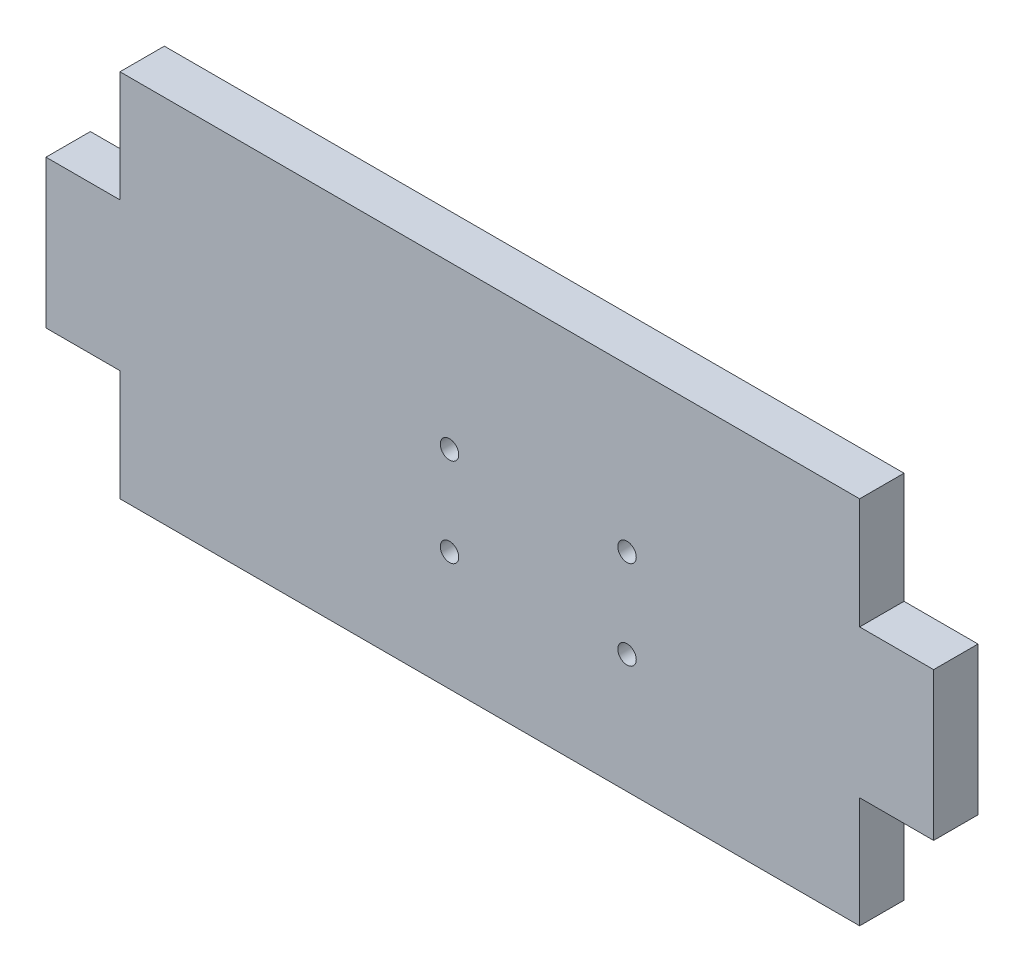
ISO-10303-21;
HEADER;
FILE_DESCRIPTION(('STEP AP214'),'2;1');
FILE_NAME('part.step','',(''),(''),'','','');
FILE_SCHEMA(('AUTOMOTIVE_DESIGN { 1 0 10303 214 1 1 1 1 }'));
ENDSEC;
DATA;
#1=APPLICATION_CONTEXT('core data for automotive mechanical design processes');
#2=APPLICATION_PROTOCOL_DEFINITION('international standard','automotive_design',2000,#1);
#3=PRODUCT_CONTEXT('',#1,'mechanical');
#4=PRODUCT('Part','Part','',(#3));
#5=PRODUCT_RELATED_PRODUCT_CATEGORY('part','',(#4));
#6=PRODUCT_DEFINITION_FORMATION('','',#4);
#7=PRODUCT_DEFINITION_CONTEXT('part definition',#1,'design');
#8=PRODUCT_DEFINITION('design','',#6,#7);
#9=PRODUCT_DEFINITION_SHAPE('','',#8);
#10=(LENGTH_UNIT() NAMED_UNIT(*) SI_UNIT(.MILLI.,.METRE.));
#11=(NAMED_UNIT(*) PLANE_ANGLE_UNIT() SI_UNIT($,.RADIAN.));
#12=(NAMED_UNIT(*) SI_UNIT($,.STERADIAN.) SOLID_ANGLE_UNIT());
#13=UNCERTAINTY_MEASURE_WITH_UNIT(LENGTH_MEASURE(1.E-05),#10,'distance_accuracy_value','');
#14=(GEOMETRIC_REPRESENTATION_CONTEXT(3) GLOBAL_UNCERTAINTY_ASSIGNED_CONTEXT((#13)) GLOBAL_UNIT_ASSIGNED_CONTEXT((#10,
#11,#12)) REPRESENTATION_CONTEXT('',''));
#15=CARTESIAN_POINT('',(0.,0.,0.));
#16=DIRECTION('',(0.,0.,1.));
#17=DIRECTION('',(1.,0.,0.));
#18=AXIS2_PLACEMENT_3D('',#15,#16,#17);
#19=CARTESIAN_POINT('',(44.550340057059,16.0653133446784,9.53553390593276));
#20=DIRECTION('',(0.,0.,-1.));
#21=DIRECTION('',(-1.,0.,0.));
#22=AXIS2_PLACEMENT_3D('',#19,#20,#21);
#23=CYLINDRICAL_SURFACE('',#22,1.25);
#24=CARTESIAN_POINT('',(44.550340057059,16.0653133446784,6.));
#25=DIRECTION('',(0.,0.,1.));
#26=DIRECTION('',(1.,0.,0.));
#27=AXIS2_PLACEMENT_3D('',#24,#25,#26);
#28=CIRCLE('',#27,1.25);
#29=CARTESIAN_POINT('',(45.800340057059,16.0653133446784,6.));
#30=VERTEX_POINT('',#29);
#31=EDGE_CURVE('E168',#30,#30,#28,.F.);
#32=ORIENTED_EDGE('',*,*,#31,.F.);
#33=EDGE_LOOP('',(#32));
#34=FACE_BOUND('',#33,.T.);
#35=CARTESIAN_POINT('',(44.550340057059,16.0653133446784,4.));
#36=DIRECTION('',(0.,0.,-1.));
#37=DIRECTION('',(-1.,0.,0.));
#38=AXIS2_PLACEMENT_3D('',#35,#36,#37);
#39=CIRCLE('',#38,1.25);
#40=CARTESIAN_POINT('',(43.300340057059,16.0653133446784,4.));
#41=VERTEX_POINT('',#40);
#42=EDGE_CURVE('E42',#41,#41,#39,.F.);
#43=ORIENTED_EDGE('',*,*,#42,.F.);
#44=EDGE_LOOP('',(#43));
#45=FACE_BOUND('',#44,.T.);
#46=ADVANCED_FACE('F38',(#34,#45),#23,.F.);
#47=CARTESIAN_POINT('',(44.550340057059,28.0653133446784,9.53553390593276));
#48=DIRECTION('',(0.,0.,-1.));
#49=DIRECTION('',(-1.,0.,0.));
#50=AXIS2_PLACEMENT_3D('',#47,#48,#49);
#51=CYLINDRICAL_SURFACE('',#50,1.25);
#52=CARTESIAN_POINT('',(44.550340057059,28.0653133446784,6.));
#53=DIRECTION('',(0.,0.,1.));
#54=DIRECTION('',(1.,0.,0.));
#55=AXIS2_PLACEMENT_3D('',#52,#53,#54);
#56=CIRCLE('',#55,1.25);
#57=CARTESIAN_POINT('',(45.800340057059,28.0653133446784,6.));
#58=VERTEX_POINT('',#57);
#59=EDGE_CURVE('E231',#58,#58,#56,.F.);
#60=ORIENTED_EDGE('',*,*,#59,.F.);
#61=EDGE_LOOP('',(#60));
#62=FACE_BOUND('',#61,.T.);
#63=CARTESIAN_POINT('',(44.550340057059,28.0653133446784,4.));
#64=DIRECTION('',(0.,0.,-1.));
#65=DIRECTION('',(-1.,0.,0.));
#66=AXIS2_PLACEMENT_3D('',#63,#64,#65);
#67=CIRCLE('',#66,1.25);
#68=CARTESIAN_POINT('',(43.300340057059,28.0653133446784,4.));
#69=VERTEX_POINT('',#68);
#70=EDGE_CURVE('E217',#69,#69,#67,.F.);
#71=ORIENTED_EDGE('',*,*,#70,.F.);
#72=EDGE_LOOP('',(#71));
#73=FACE_BOUND('',#72,.T.);
#74=ADVANCED_FACE('F273',(#62,#73),#51,.F.);
#75=CARTESIAN_POINT('',(68.550340057059,28.0653133446784,9.53553390593276));
#76=DIRECTION('',(0.,0.,-1.));
#77=DIRECTION('',(-1.,0.,0.));
#78=AXIS2_PLACEMENT_3D('',#75,#76,#77);
#79=CYLINDRICAL_SURFACE('',#78,1.25);
#80=CARTESIAN_POINT('',(68.550340057059,28.0653133446784,6.));
#81=DIRECTION('',(0.,0.,1.));
#82=DIRECTION('',(1.,0.,0.));
#83=AXIS2_PLACEMENT_3D('',#80,#81,#82);
#84=CIRCLE('',#83,1.25);
#85=CARTESIAN_POINT('',(69.800340057059,28.0653133446784,6.));
#86=VERTEX_POINT('',#85);
#87=EDGE_CURVE('E226',#86,#86,#84,.F.);
#88=ORIENTED_EDGE('',*,*,#87,.F.);
#89=EDGE_LOOP('',(#88));
#90=FACE_BOUND('',#89,.T.);
#91=CARTESIAN_POINT('',(68.550340057059,28.0653133446784,4.));
#92=DIRECTION('',(0.,0.,-1.));
#93=DIRECTION('',(-1.,0.,0.));
#94=AXIS2_PLACEMENT_3D('',#91,#92,#93);
#95=CIRCLE('',#94,1.25);
#96=CARTESIAN_POINT('',(67.300340057059,28.0653133446784,4.));
#97=VERTEX_POINT('',#96);
#98=EDGE_CURVE('E214',#97,#97,#95,.F.);
#99=ORIENTED_EDGE('',*,*,#98,.F.);
#100=EDGE_LOOP('',(#99));
#101=FACE_BOUND('',#100,.T.);
#102=ADVANCED_FACE('F279',(#90,#101),#79,.F.);
#103=CARTESIAN_POINT('',(68.550340057059,16.0653133446784,9.53553390593276));
#104=DIRECTION('',(0.,0.,-1.));
#105=DIRECTION('',(-1.,0.,0.));
#106=AXIS2_PLACEMENT_3D('',#103,#104,#105);
#107=CYLINDRICAL_SURFACE('',#106,1.25);
#108=CARTESIAN_POINT('',(68.550340057059,16.0653133446784,6.));
#109=DIRECTION('',(0.,0.,1.));
#110=DIRECTION('',(1.,0.,0.));
#111=AXIS2_PLACEMENT_3D('',#108,#109,#110);
#112=CIRCLE('',#111,1.25);
#113=CARTESIAN_POINT('',(69.800340057059,16.0653133446784,6.));
#114=VERTEX_POINT('',#113);
#115=EDGE_CURVE('E222',#114,#114,#112,.F.);
#116=ORIENTED_EDGE('',*,*,#115,.F.);
#117=EDGE_LOOP('',(#116));
#118=FACE_BOUND('',#117,.T.);
#119=CARTESIAN_POINT('',(68.550340057059,16.0653133446784,4.));
#120=DIRECTION('',(0.,0.,-1.));
#121=DIRECTION('',(-1.,0.,0.));
#122=AXIS2_PLACEMENT_3D('',#119,#120,#121);
#123=CIRCLE('',#122,1.25);
#124=CARTESIAN_POINT('',(67.300340057059,16.0653133446784,4.));
#125=VERTEX_POINT('',#124);
#126=EDGE_CURVE('E211',#125,#125,#123,.F.);
#127=ORIENTED_EDGE('',*,*,#126,.F.);
#128=EDGE_LOOP('',(#127));
#129=FACE_BOUND('',#128,.T.);
#130=ADVANCED_FACE('F285',(#118,#129),#107,.F.);
#131=CARTESIAN_POINT('',(0.,35.,6.));
#132=DIRECTION('',(0.,-1.,0.));
#133=DIRECTION('',(0.,0.,-1.));
#134=AXIS2_PLACEMENT_3D('',#131,#132,#133);
#135=PLANE('',#134);
#136=DIRECTION('',(-1.,0.,0.));
#137=VECTOR('',#136,1.);
#138=CARTESIAN_POINT('',(0.,35.,0.));
#139=LINE('',#138,#137);
#140=CARTESIAN_POINT('',(0.,35.,0.));
#141=VERTEX_POINT('',#140);
#142=CARTESIAN_POINT('',(-10.,35.,0.));
#143=VERTEX_POINT('',#142);
#144=EDGE_CURVE('E165',#141,#143,#139,.T.);
#145=ORIENTED_EDGE('',*,*,#144,.T.);
#146=DIRECTION('',(0.,0.,-1.));
#147=VECTOR('',#146,1.);
#148=CARTESIAN_POINT('',(-10.,35.,6.));
#149=LINE('',#148,#147);
#150=CARTESIAN_POINT('',(-10.,35.,6.));
#151=VERTEX_POINT('',#150);
#152=EDGE_CURVE('E11',#151,#143,#149,.T.);
#153=ORIENTED_EDGE('',*,*,#152,.F.);
#154=DIRECTION('',(-1.,0.,0.));
#155=VECTOR('',#154,1.);
#156=CARTESIAN_POINT('',(0.,35.,6.));
#157=LINE('',#156,#155);
#158=CARTESIAN_POINT('',(0.,35.,6.));
#159=VERTEX_POINT('',#158);
#160=EDGE_CURVE('E237',#159,#151,#157,.T.);
#161=ORIENTED_EDGE('',*,*,#160,.F.);
#162=DIRECTION('',(0.,0.,-1.));
#163=VECTOR('',#162,1.);
#164=CARTESIAN_POINT('',(0.,35.,6.));
#165=LINE('',#164,#163);
#166=EDGE_CURVE('E57',#159,#141,#165,.T.);
#167=ORIENTED_EDGE('',*,*,#166,.T.);
#168=EDGE_LOOP('',(#145,#153,#161,#167));
#169=FACE_BOUND('',#168,.T.);
#170=ADVANCED_FACE('F40',(#169),#135,.F.);
#171=CARTESIAN_POINT('',(-10.,0.,6.));
#172=DIRECTION('',(1.,0.,0.));
#173=DIRECTION('',(0.,1.,0.));
#174=AXIS2_PLACEMENT_3D('',#171,#172,#173);
#175=PLANE('',#174);
#176=DIRECTION('',(0.,-1.,0.));
#177=VECTOR('',#176,1.);
#178=CARTESIAN_POINT('',(-10.,0.,0.));
#179=LINE('',#178,#177);
#180=CARTESIAN_POINT('',(-10.,15.,0.));
#181=VERTEX_POINT('',#180);
#182=EDGE_CURVE('E167',#143,#181,#179,.T.);
#183=ORIENTED_EDGE('',*,*,#182,.T.);
#184=DIRECTION('',(0.,0.,-1.));
#185=VECTOR('',#184,1.);
#186=CARTESIAN_POINT('',(-10.,15.,6.));
#187=LINE('',#186,#185);
#188=CARTESIAN_POINT('',(-10.,15.,6.));
#189=VERTEX_POINT('',#188);
#190=EDGE_CURVE('E48',#189,#181,#187,.T.);
#191=ORIENTED_EDGE('',*,*,#190,.F.);
#192=DIRECTION('',(0.,-1.,0.));
#193=VECTOR('',#192,1.);
#194=CARTESIAN_POINT('',(-10.,0.,6.));
#195=LINE('',#194,#193);
#196=EDGE_CURVE('E107',#151,#189,#195,.T.);
#197=ORIENTED_EDGE('',*,*,#196,.F.);
#198=ORIENTED_EDGE('',*,*,#152,.T.);
#199=EDGE_LOOP('',(#183,#191,#197,#198));
#200=FACE_BOUND('',#199,.T.);
#201=ADVANCED_FACE('F377',(#200),#175,.F.);
#202=CARTESIAN_POINT('',(0.,15.,6.));
#203=DIRECTION('',(0.,-1.,0.));
#204=DIRECTION('',(0.,0.,-1.));
#205=AXIS2_PLACEMENT_3D('',#202,#203,#204);
#206=PLANE('',#205);
#207=DIRECTION('',(-1.,0.,0.));
#208=VECTOR('',#207,1.);
#209=CARTESIAN_POINT('',(0.,15.,0.));
#210=LINE('',#209,#208);
#211=CARTESIAN_POINT('',(0.,15.,0.));
#212=VERTEX_POINT('',#211);
#213=EDGE_CURVE('E171',#212,#181,#210,.T.);
#214=ORIENTED_EDGE('',*,*,#213,.F.);
#215=DIRECTION('',(0.,0.,-1.));
#216=VECTOR('',#215,1.);
#217=CARTESIAN_POINT('',(0.,15.,6.));
#218=LINE('',#217,#216);
#219=CARTESIAN_POINT('',(0.,15.,6.));
#220=VERTEX_POINT('',#219);
#221=EDGE_CURVE('E208',#220,#212,#218,.T.);
#222=ORIENTED_EDGE('',*,*,#221,.F.);
#223=DIRECTION('',(-1.,0.,0.));
#224=VECTOR('',#223,1.);
#225=CARTESIAN_POINT('',(0.,15.,6.));
#226=LINE('',#225,#224);
#227=EDGE_CURVE('E240',#220,#189,#226,.T.);
#228=ORIENTED_EDGE('',*,*,#227,.T.);
#229=ORIENTED_EDGE('',*,*,#190,.T.);
#230=EDGE_LOOP('',(#214,#222,#228,#229));
#231=FACE_BOUND('',#230,.T.);
#232=ADVANCED_FACE('F270',(#231),#206,.T.);
#233=CARTESIAN_POINT('',(0.,0.,6.));
#234=DIRECTION('',(-1.,0.,0.));
#235=DIRECTION('',(0.,0.,1.));
#236=AXIS2_PLACEMENT_3D('',#233,#234,#235);
#237=PLANE('',#236);
#238=DIRECTION('',(0.,1.,0.));
#239=VECTOR('',#238,1.);
#240=CARTESIAN_POINT('',(0.,0.,0.));
#241=LINE('',#240,#239);
#242=CARTESIAN_POINT('',(0.,0.,0.));
#243=VERTEX_POINT('',#242);
#244=EDGE_CURVE('E174',#243,#212,#241,.T.);
#245=ORIENTED_EDGE('',*,*,#244,.F.);
#246=DIRECTION('',(0.,0.,-1.));
#247=VECTOR('',#246,1.);
#248=CARTESIAN_POINT('',(0.,0.,6.));
#249=LINE('',#248,#247);
#250=CARTESIAN_POINT('',(0.,0.,6.));
#251=VERTEX_POINT('',#250);
#252=EDGE_CURVE('E206',#251,#243,#249,.T.);
#253=ORIENTED_EDGE('',*,*,#252,.F.);
#254=DIRECTION('',(0.,1.,0.));
#255=VECTOR('',#254,1.);
#256=CARTESIAN_POINT('',(0.,0.,6.));
#257=LINE('',#256,#255);
#258=EDGE_CURVE('E161',#251,#220,#257,.T.);
#259=ORIENTED_EDGE('',*,*,#258,.T.);
#260=ORIENTED_EDGE('',*,*,#221,.T.);
#261=EDGE_LOOP('',(#245,#253,#259,#260));
#262=FACE_BOUND('',#261,.T.);
#263=ADVANCED_FACE('F260',(#262),#237,.T.);
#264=CARTESIAN_POINT('',(0.,0.,6.));
#265=DIRECTION('',(0.,1.,0.));
#266=DIRECTION('',(0.,0.,1.));
#267=AXIS2_PLACEMENT_3D('',#264,#265,#266);
#268=PLANE('',#267);
#269=DIRECTION('',(1.,0.,0.));
#270=VECTOR('',#269,1.);
#271=CARTESIAN_POINT('',(0.,0.,0.));
#272=LINE('',#271,#270);
#273=CARTESIAN_POINT('',(100.,0.,0.));
#274=VERTEX_POINT('',#273);
#275=EDGE_CURVE('E177',#243,#274,#272,.T.);
#276=ORIENTED_EDGE('',*,*,#275,.T.);
#277=DIRECTION('',(0.,0.,-1.));
#278=VECTOR('',#277,1.);
#279=CARTESIAN_POINT('',(100.,0.,6.));
#280=LINE('',#279,#278);
#281=CARTESIAN_POINT('',(100.,0.,6.));
#282=VERTEX_POINT('',#281);
#283=EDGE_CURVE('E203',#282,#274,#280,.T.);
#284=ORIENTED_EDGE('',*,*,#283,.F.);
#285=DIRECTION('',(1.,0.,0.));
#286=VECTOR('',#285,1.);
#287=CARTESIAN_POINT('',(0.,0.,6.));
#288=LINE('',#287,#286);
#289=EDGE_CURVE('E244',#251,#282,#288,.T.);
#290=ORIENTED_EDGE('',*,*,#289,.F.);
#291=ORIENTED_EDGE('',*,*,#252,.T.);
#292=EDGE_LOOP('',(#276,#284,#290,#291));
#293=FACE_BOUND('',#292,.T.);
#294=ADVANCED_FACE('F269',(#293),#268,.F.);
#295=CARTESIAN_POINT('',(100.,0.,6.));
#296=DIRECTION('',(-1.,0.,0.));
#297=DIRECTION('',(0.,0.,1.));
#298=AXIS2_PLACEMENT_3D('',#295,#296,#297);
#299=PLANE('',#298);
#300=DIRECTION('',(0.,1.,0.));
#301=VECTOR('',#300,1.);
#302=CARTESIAN_POINT('',(100.,0.,0.));
#303=LINE('',#302,#301);
#304=CARTESIAN_POINT('',(100.,15.,0.));
#305=VERTEX_POINT('',#304);
#306=EDGE_CURVE('E180',#274,#305,#303,.T.);
#307=ORIENTED_EDGE('',*,*,#306,.T.);
#308=DIRECTION('',(0.,0.,-1.));
#309=VECTOR('',#308,1.);
#310=CARTESIAN_POINT('',(100.,15.,6.));
#311=LINE('',#310,#309);
#312=CARTESIAN_POINT('',(100.,15.,6.));
#313=VERTEX_POINT('',#312);
#314=EDGE_CURVE('E200',#313,#305,#311,.T.);
#315=ORIENTED_EDGE('',*,*,#314,.F.);
#316=DIRECTION('',(0.,1.,0.));
#317=VECTOR('',#316,1.);
#318=CARTESIAN_POINT('',(100.,0.,6.));
#319=LINE('',#318,#317);
#320=EDGE_CURVE('E147',#282,#313,#319,.T.);
#321=ORIENTED_EDGE('',*,*,#320,.F.);
#322=ORIENTED_EDGE('',*,*,#283,.T.);
#323=EDGE_LOOP('',(#307,#315,#321,#322));
#324=FACE_BOUND('',#323,.T.);
#325=ADVANCED_FACE('F399',(#324),#299,.F.);
#326=CARTESIAN_POINT('',(0.,15.,6.));
#327=DIRECTION('',(0.,1.,0.));
#328=DIRECTION('',(0.,0.,1.));
#329=AXIS2_PLACEMENT_3D('',#326,#327,#328);
#330=PLANE('',#329);
#331=DIRECTION('',(1.,0.,0.));
#332=VECTOR('',#331,1.);
#333=CARTESIAN_POINT('',(0.,15.,0.));
#334=LINE('',#333,#332);
#335=CARTESIAN_POINT('',(110.,15.,0.));
#336=VERTEX_POINT('',#335);
#337=EDGE_CURVE('E182',#305,#336,#334,.T.);
#338=ORIENTED_EDGE('',*,*,#337,.T.);
#339=DIRECTION('',(0.,0.,-1.));
#340=VECTOR('',#339,1.);
#341=CARTESIAN_POINT('',(110.,15.,6.));
#342=LINE('',#341,#340);
#343=CARTESIAN_POINT('',(110.,15.,6.));
#344=VERTEX_POINT('',#343);
#345=EDGE_CURVE('E198',#344,#336,#342,.T.);
#346=ORIENTED_EDGE('',*,*,#345,.F.);
#347=DIRECTION('',(1.,0.,0.));
#348=VECTOR('',#347,1.);
#349=CARTESIAN_POINT('',(0.,15.,6.));
#350=LINE('',#349,#348);
#351=EDGE_CURVE('E246',#313,#344,#350,.T.);
#352=ORIENTED_EDGE('',*,*,#351,.F.);
#353=ORIENTED_EDGE('',*,*,#314,.T.);
#354=EDGE_LOOP('',(#338,#346,#352,#353));
#355=FACE_BOUND('',#354,.T.);
#356=ADVANCED_FACE('F403',(#355),#330,.F.);
#357=CARTESIAN_POINT('',(110.,0.,6.));
#358=DIRECTION('',(1.,0.,0.));
#359=DIRECTION('',(0.,0.,-1.));
#360=AXIS2_PLACEMENT_3D('',#357,#358,#359);
#361=PLANE('',#360);
#362=DIRECTION('',(0.,-1.,0.));
#363=VECTOR('',#362,1.);
#364=CARTESIAN_POINT('',(110.,0.,0.));
#365=LINE('',#364,#363);
#366=CARTESIAN_POINT('',(110.,35.,0.));
#367=VERTEX_POINT('',#366);
#368=EDGE_CURVE('E185',#367,#336,#365,.T.);
#369=ORIENTED_EDGE('',*,*,#368,.F.);
#370=DIRECTION('',(0.,0.,-1.));
#371=VECTOR('',#370,1.);
#372=CARTESIAN_POINT('',(110.,35.,6.));
#373=LINE('',#372,#371);
#374=CARTESIAN_POINT('',(110.,35.,6.));
#375=VERTEX_POINT('',#374);
#376=EDGE_CURVE('E196',#375,#367,#373,.T.);
#377=ORIENTED_EDGE('',*,*,#376,.F.);
#378=DIRECTION('',(0.,-1.,0.));
#379=VECTOR('',#378,1.);
#380=CARTESIAN_POINT('',(110.,0.,6.));
#381=LINE('',#380,#379);
#382=EDGE_CURVE('E247',#375,#344,#381,.T.);
#383=ORIENTED_EDGE('',*,*,#382,.T.);
#384=ORIENTED_EDGE('',*,*,#345,.T.);
#385=EDGE_LOOP('',(#369,#377,#383,#384));
#386=FACE_BOUND('',#385,.T.);
#387=ADVANCED_FACE('F404',(#386),#361,.T.);
#388=CARTESIAN_POINT('',(0.,35.,6.));
#389=DIRECTION('',(0.,1.,0.));
#390=DIRECTION('',(0.,0.,1.));
#391=AXIS2_PLACEMENT_3D('',#388,#389,#390);
#392=PLANE('',#391);
#393=DIRECTION('',(1.,0.,0.));
#394=VECTOR('',#393,1.);
#395=CARTESIAN_POINT('',(0.,35.,0.));
#396=LINE('',#395,#394);
#397=CARTESIAN_POINT('',(100.,35.,0.));
#398=VERTEX_POINT('',#397);
#399=EDGE_CURVE('E188',#398,#367,#396,.T.);
#400=ORIENTED_EDGE('',*,*,#399,.F.);
#401=DIRECTION('',(0.,0.,-1.));
#402=VECTOR('',#401,1.);
#403=CARTESIAN_POINT('',(100.,35.,6.));
#404=LINE('',#403,#402);
#405=CARTESIAN_POINT('',(100.,35.,6.));
#406=VERTEX_POINT('',#405);
#407=EDGE_CURVE('E155',#406,#398,#404,.T.);
#408=ORIENTED_EDGE('',*,*,#407,.F.);
#409=DIRECTION('',(1.,0.,0.));
#410=VECTOR('',#409,1.);
#411=CARTESIAN_POINT('',(0.,35.,6.));
#412=LINE('',#411,#410);
#413=EDGE_CURVE('E144',#406,#375,#412,.T.);
#414=ORIENTED_EDGE('',*,*,#413,.T.);
#415=ORIENTED_EDGE('',*,*,#376,.T.);
#416=EDGE_LOOP('',(#400,#408,#414,#415));
#417=FACE_BOUND('',#416,.T.);
#418=ADVANCED_FACE('F252',(#417),#392,.T.);
#419=CARTESIAN_POINT('',(100.,50.,0.));
#420=VERTEX_POINT('',#419);
#421=EDGE_CURVE('E152',#398,#420,#303,.T.);
#422=ORIENTED_EDGE('',*,*,#421,.T.);
#423=DIRECTION('',(0.,0.,-1.));
#424=VECTOR('',#423,1.);
#425=CARTESIAN_POINT('',(100.,50.,6.));
#426=LINE('',#425,#424);
#427=CARTESIAN_POINT('',(100.,50.,6.));
#428=VERTEX_POINT('',#427);
#429=EDGE_CURVE('E149',#428,#420,#426,.T.);
#430=ORIENTED_EDGE('',*,*,#429,.F.);
#431=EDGE_CURVE('E136',#406,#428,#319,.T.);
#432=ORIENTED_EDGE('',*,*,#431,.F.);
#433=ORIENTED_EDGE('',*,*,#407,.T.);
#434=EDGE_LOOP('',(#422,#430,#432,#433));
#435=FACE_BOUND('',#434,.T.);
#436=ADVANCED_FACE('F150',(#435),#299,.F.);
#437=CARTESIAN_POINT('',(0.,50.,6.));
#438=DIRECTION('',(0.,1.,0.));
#439=DIRECTION('',(0.,0.,1.));
#440=AXIS2_PLACEMENT_3D('',#437,#438,#439);
#441=PLANE('',#440);
#442=DIRECTION('',(1.,0.,0.));
#443=VECTOR('',#442,1.);
#444=CARTESIAN_POINT('',(0.,50.,0.));
#445=LINE('',#444,#443);
#446=CARTESIAN_POINT('',(0.,50.,0.));
#447=VERTEX_POINT('',#446);
#448=EDGE_CURVE('E191',#447,#420,#445,.T.);
#449=ORIENTED_EDGE('',*,*,#448,.F.);
#450=DIRECTION('',(0.,0.,-1.));
#451=VECTOR('',#450,1.);
#452=CARTESIAN_POINT('',(0.,50.,6.));
#453=LINE('',#452,#451);
#454=CARTESIAN_POINT('',(0.,50.,6.));
#455=VERTEX_POINT('',#454);
#456=EDGE_CURVE('E95',#455,#447,#453,.T.);
#457=ORIENTED_EDGE('',*,*,#456,.F.);
#458=DIRECTION('',(1.,0.,0.));
#459=VECTOR('',#458,1.);
#460=CARTESIAN_POINT('',(0.,50.,6.));
#461=LINE('',#460,#459);
#462=EDGE_CURVE('E141',#455,#428,#461,.T.);
#463=ORIENTED_EDGE('',*,*,#462,.T.);
#464=ORIENTED_EDGE('',*,*,#429,.T.);
#465=EDGE_LOOP('',(#449,#457,#463,#464));
#466=FACE_BOUND('',#465,.T.);
#467=ADVANCED_FACE('F157',(#466),#441,.T.);
#468=EDGE_CURVE('E178',#141,#447,#241,.T.);
#469=ORIENTED_EDGE('',*,*,#468,.F.);
#470=ORIENTED_EDGE('',*,*,#166,.F.);
#471=EDGE_CURVE('E158',#159,#455,#257,.T.);
#472=ORIENTED_EDGE('',*,*,#471,.T.);
#473=ORIENTED_EDGE('',*,*,#456,.T.);
#474=EDGE_LOOP('',(#469,#470,#472,#473));
#475=FACE_BOUND('',#474,.T.);
#476=ADVANCED_FACE('F257',(#475),#237,.T.);
#477=CARTESIAN_POINT('',(0.,0.,6.));
#478=DIRECTION('',(0.,0.,1.));
#479=DIRECTION('',(1.,0.,0.));
#480=AXIS2_PLACEMENT_3D('',#477,#478,#479);
#481=PLANE('',#480);
#482=ORIENTED_EDGE('',*,*,#115,.T.);
#483=EDGE_LOOP('',(#482));
#484=FACE_BOUND('',#483,.T.);
#485=ORIENTED_EDGE('',*,*,#87,.T.);
#486=EDGE_LOOP('',(#485));
#487=FACE_BOUND('',#486,.T.);
#488=ORIENTED_EDGE('',*,*,#59,.T.);
#489=EDGE_LOOP('',(#488));
#490=FACE_BOUND('',#489,.T.);
#491=ORIENTED_EDGE('',*,*,#31,.T.);
#492=EDGE_LOOP('',(#491));
#493=FACE_BOUND('',#492,.T.);
#494=ORIENTED_EDGE('',*,*,#160,.T.);
#495=ORIENTED_EDGE('',*,*,#196,.T.);
#496=ORIENTED_EDGE('',*,*,#227,.F.);
#497=ORIENTED_EDGE('',*,*,#258,.F.);
#498=ORIENTED_EDGE('',*,*,#289,.T.);
#499=ORIENTED_EDGE('',*,*,#320,.T.);
#500=ORIENTED_EDGE('',*,*,#351,.T.);
#501=ORIENTED_EDGE('',*,*,#382,.F.);
#502=ORIENTED_EDGE('',*,*,#413,.F.);
#503=ORIENTED_EDGE('',*,*,#431,.T.);
#504=ORIENTED_EDGE('',*,*,#462,.F.);
#505=ORIENTED_EDGE('',*,*,#471,.F.);
#506=EDGE_LOOP('',(#494,#495,#496,#497,#498,#499,#500,#501,#502,#503,#504,#505));
#507=FACE_BOUND('',#506,.T.);
#508=ADVANCED_FACE('F138',(#484,#487,#490,#493,#507),#481,.T.);
#509=CARTESIAN_POINT('',(0.,0.,0.));
#510=DIRECTION('',(0.,0.,1.));
#511=DIRECTION('',(1.,0.,0.));
#512=AXIS2_PLACEMENT_3D('',#509,#510,#511);
#513=PLANE('',#512);
#514=CARTESIAN_POINT('',(68.550340057059,16.0653133446784,0.));
#515=DIRECTION('',(0.,0.,-1.));
#516=DIRECTION('',(-1.,0.,0.));
#517=AXIS2_PLACEMENT_3D('',#514,#515,#516);
#518=CIRCLE('',#517,2.5);
#519=CARTESIAN_POINT('',(66.050340057059,16.0653133446784,0.));
#520=VERTEX_POINT('',#519);
#521=EDGE_CURVE('E299',#520,#520,#518,.T.);
#522=ORIENTED_EDGE('',*,*,#521,.F.);
#523=EDGE_LOOP('',(#522));
#524=FACE_BOUND('',#523,.T.);
#525=CARTESIAN_POINT('',(44.550340057059,16.0653133446784,0.));
#526=DIRECTION('',(0.,0.,-1.));
#527=DIRECTION('',(-1.,0.,0.));
#528=AXIS2_PLACEMENT_3D('',#525,#526,#527);
#529=CIRCLE('',#528,2.5);
#530=CARTESIAN_POINT('',(42.050340057059,16.0653133446784,0.));
#531=VERTEX_POINT('',#530);
#532=EDGE_CURVE('E303',#531,#531,#529,.T.);
#533=ORIENTED_EDGE('',*,*,#532,.F.);
#534=EDGE_LOOP('',(#533));
#535=FACE_BOUND('',#534,.T.);
#536=CARTESIAN_POINT('',(44.550340057059,28.0653133446784,0.));
#537=DIRECTION('',(0.,0.,-1.));
#538=DIRECTION('',(-1.,0.,0.));
#539=AXIS2_PLACEMENT_3D('',#536,#537,#538);
#540=CIRCLE('',#539,2.5);
#541=CARTESIAN_POINT('',(42.050340057059,28.0653133446784,0.));
#542=VERTEX_POINT('',#541);
#543=EDGE_CURVE('E307',#542,#542,#540,.T.);
#544=ORIENTED_EDGE('',*,*,#543,.F.);
#545=EDGE_LOOP('',(#544));
#546=FACE_BOUND('',#545,.T.);
#547=CARTESIAN_POINT('',(68.550340057059,28.0653133446784,0.));
#548=DIRECTION('',(0.,0.,-1.));
#549=DIRECTION('',(-1.,0.,0.));
#550=AXIS2_PLACEMENT_3D('',#547,#548,#549);
#551=CIRCLE('',#550,2.5);
#552=CARTESIAN_POINT('',(66.050340057059,28.0653133446784,0.));
#553=VERTEX_POINT('',#552);
#554=EDGE_CURVE('E310',#553,#553,#551,.T.);
#555=ORIENTED_EDGE('',*,*,#554,.F.);
#556=EDGE_LOOP('',(#555));
#557=FACE_BOUND('',#556,.T.);
#558=ORIENTED_EDGE('',*,*,#144,.F.);
#559=ORIENTED_EDGE('',*,*,#468,.T.);
#560=ORIENTED_EDGE('',*,*,#448,.T.);
#561=ORIENTED_EDGE('',*,*,#421,.F.);
#562=ORIENTED_EDGE('',*,*,#399,.T.);
#563=ORIENTED_EDGE('',*,*,#368,.T.);
#564=ORIENTED_EDGE('',*,*,#337,.F.);
#565=ORIENTED_EDGE('',*,*,#306,.F.);
#566=ORIENTED_EDGE('',*,*,#275,.F.);
#567=ORIENTED_EDGE('',*,*,#244,.T.);
#568=ORIENTED_EDGE('',*,*,#213,.T.);
#569=ORIENTED_EDGE('',*,*,#182,.F.);
#570=EDGE_LOOP('',(#558,#559,#560,#561,#562,#563,#564,#565,#566,#567,#568,#569));
#571=FACE_BOUND('',#570,.T.);
#572=ADVANCED_FACE('F255',(#524,#535,#546,#557,#571),#513,.F.);
#573=CARTESIAN_POINT('',(68.550340057059,16.0653133446784,4.));
#574=DIRECTION('',(0.,0.,-1.));
#575=DIRECTION('',(-1.,0.,0.));
#576=AXIS2_PLACEMENT_3D('',#573,#574,#575);
#577=PLANE('',#576);
#578=CARTESIAN_POINT('',(68.550340057059,16.0653133446784,4.));
#579=DIRECTION('',(0.,0.,-1.));
#580=DIRECTION('',(-1.,0.,0.));
#581=AXIS2_PLACEMENT_3D('',#578,#579,#580);
#582=CIRCLE('',#581,2.5);
#583=CARTESIAN_POINT('',(66.050340057059,16.0653133446784,4.));
#584=VERTEX_POINT('',#583);
#585=EDGE_CURVE('E325',#584,#584,#582,.T.);
#586=ORIENTED_EDGE('',*,*,#585,.T.);
#587=EDGE_LOOP('',(#586));
#588=FACE_BOUND('',#587,.T.);
#589=ORIENTED_EDGE('',*,*,#126,.T.);
#590=EDGE_LOOP('',(#589));
#591=FACE_BOUND('',#590,.T.);
#592=ADVANCED_FACE('F288',(#588,#591),#577,.T.);
#593=CARTESIAN_POINT('',(68.550340057059,16.0653133446784,4.));
#594=DIRECTION('',(0.,0.,-1.));
#595=DIRECTION('',(-1.,0.,0.));
#596=AXIS2_PLACEMENT_3D('',#593,#594,#595);
#597=CYLINDRICAL_SURFACE('',#596,2.5);
#598=ORIENTED_EDGE('',*,*,#585,.F.);
#599=EDGE_LOOP('',(#598));
#600=FACE_BOUND('',#599,.T.);
#601=ORIENTED_EDGE('',*,*,#521,.T.);
#602=EDGE_LOOP('',(#601));
#603=FACE_BOUND('',#602,.T.);
#604=ADVANCED_FACE('F293',(#600,#603),#597,.F.);
#605=CARTESIAN_POINT('',(68.550340057059,28.0653133446784,4.));
#606=DIRECTION('',(0.,0.,-1.));
#607=DIRECTION('',(-1.,0.,0.));
#608=AXIS2_PLACEMENT_3D('',#605,#606,#607);
#609=PLANE('',#608);
#610=CARTESIAN_POINT('',(68.550340057059,28.0653133446784,4.));
#611=DIRECTION('',(0.,0.,-1.));
#612=DIRECTION('',(-1.,0.,0.));
#613=AXIS2_PLACEMENT_3D('',#610,#611,#612);
#614=CIRCLE('',#613,2.5);
#615=CARTESIAN_POINT('',(66.050340057059,28.0653133446784,4.));
#616=VERTEX_POINT('',#615);
#617=EDGE_CURVE('E215',#616,#616,#614,.T.);
#618=ORIENTED_EDGE('',*,*,#617,.T.);
#619=EDGE_LOOP('',(#618));
#620=FACE_BOUND('',#619,.T.);
#621=ORIENTED_EDGE('',*,*,#98,.T.);
#622=EDGE_LOOP('',(#621));
#623=FACE_BOUND('',#622,.T.);
#624=ADVANCED_FACE('F356',(#620,#623),#609,.T.);
#625=CARTESIAN_POINT('',(68.550340057059,28.0653133446784,4.));
#626=DIRECTION('',(0.,0.,-1.));
#627=DIRECTION('',(-1.,0.,0.));
#628=AXIS2_PLACEMENT_3D('',#625,#626,#627);
#629=CYLINDRICAL_SURFACE('',#628,2.5);
#630=ORIENTED_EDGE('',*,*,#617,.F.);
#631=EDGE_LOOP('',(#630));
#632=FACE_BOUND('',#631,.T.);
#633=ORIENTED_EDGE('',*,*,#554,.T.);
#634=EDGE_LOOP('',(#633));
#635=FACE_BOUND('',#634,.T.);
#636=ADVANCED_FACE('F346',(#632,#635),#629,.F.);
#637=CARTESIAN_POINT('',(44.550340057059,28.0653133446784,4.));
#638=DIRECTION('',(0.,0.,-1.));
#639=DIRECTION('',(-1.,0.,0.));
#640=AXIS2_PLACEMENT_3D('',#637,#638,#639);
#641=PLANE('',#640);
#642=CARTESIAN_POINT('',(44.550340057059,28.0653133446784,4.));
#643=DIRECTION('',(0.,0.,-1.));
#644=DIRECTION('',(-1.,0.,0.));
#645=AXIS2_PLACEMENT_3D('',#642,#643,#644);
#646=CIRCLE('',#645,2.5);
#647=CARTESIAN_POINT('',(42.050340057059,28.0653133446784,4.));
#648=VERTEX_POINT('',#647);
#649=EDGE_CURVE('E312',#648,#648,#646,.T.);
#650=ORIENTED_EDGE('',*,*,#649,.T.);
#651=EDGE_LOOP('',(#650));
#652=FACE_BOUND('',#651,.T.);
#653=ORIENTED_EDGE('',*,*,#70,.T.);
#654=EDGE_LOOP('',(#653));
#655=FACE_BOUND('',#654,.T.);
#656=ADVANCED_FACE('F336',(#652,#655),#641,.T.);
#657=CARTESIAN_POINT('',(44.550340057059,28.0653133446784,4.));
#658=DIRECTION('',(0.,0.,-1.));
#659=DIRECTION('',(-1.,0.,0.));
#660=AXIS2_PLACEMENT_3D('',#657,#658,#659);
#661=CYLINDRICAL_SURFACE('',#660,2.5);
#662=ORIENTED_EDGE('',*,*,#649,.F.);
#663=EDGE_LOOP('',(#662));
#664=FACE_BOUND('',#663,.T.);
#665=ORIENTED_EDGE('',*,*,#543,.T.);
#666=EDGE_LOOP('',(#665));
#667=FACE_BOUND('',#666,.T.);
#668=ADVANCED_FACE('F333',(#664,#667),#661,.F.);
#669=CARTESIAN_POINT('',(44.550340057059,16.0653133446784,4.));
#670=DIRECTION('',(0.,0.,-1.));
#671=DIRECTION('',(-1.,0.,0.));
#672=AXIS2_PLACEMENT_3D('',#669,#670,#671);
#673=PLANE('',#672);
#674=CARTESIAN_POINT('',(44.550340057059,16.0653133446784,4.));
#675=DIRECTION('',(0.,0.,-1.));
#676=DIRECTION('',(-1.,0.,0.));
#677=AXIS2_PLACEMENT_3D('',#674,#675,#676);
#678=CIRCLE('',#677,2.5);
#679=CARTESIAN_POINT('',(42.050340057059,16.0653133446784,4.));
#680=VERTEX_POINT('',#679);
#681=EDGE_CURVE('E329',#680,#680,#678,.T.);
#682=ORIENTED_EDGE('',*,*,#681,.T.);
#683=EDGE_LOOP('',(#682));
#684=FACE_BOUND('',#683,.T.);
#685=ORIENTED_EDGE('',*,*,#42,.T.);
#686=EDGE_LOOP('',(#685));
#687=FACE_BOUND('',#686,.T.);
#688=ADVANCED_FACE('F335',(#684,#687),#673,.T.);
#689=CARTESIAN_POINT('',(44.550340057059,16.0653133446784,4.));
#690=DIRECTION('',(0.,0.,-1.));
#691=DIRECTION('',(-1.,0.,0.));
#692=AXIS2_PLACEMENT_3D('',#689,#690,#691);
#693=CYLINDRICAL_SURFACE('',#692,2.5);
#694=ORIENTED_EDGE('',*,*,#681,.F.);
#695=EDGE_LOOP('',(#694));
#696=FACE_BOUND('',#695,.T.);
#697=ORIENTED_EDGE('',*,*,#532,.T.);
#698=EDGE_LOOP('',(#697));
#699=FACE_BOUND('',#698,.T.);
#700=ADVANCED_FACE('F343',(#696,#699),#693,.F.);
#701=CLOSED_SHELL('',(#46,#74,#102,#130,#170,#201,#232,#263,#294,#325,#356,#387,#418,#436,#467,
#476,#508,#572,#592,#604,#624,#636,#656,#668,#688,#700));
#702=MANIFOLD_SOLID_BREP('B2',#701);
#703=ADVANCED_BREP_SHAPE_REPRESENTATION('',(#18,#702),#14);
#704=SHAPE_DEFINITION_REPRESENTATION(#9,#703);
ENDSEC;
END-ISO-10303-21;
